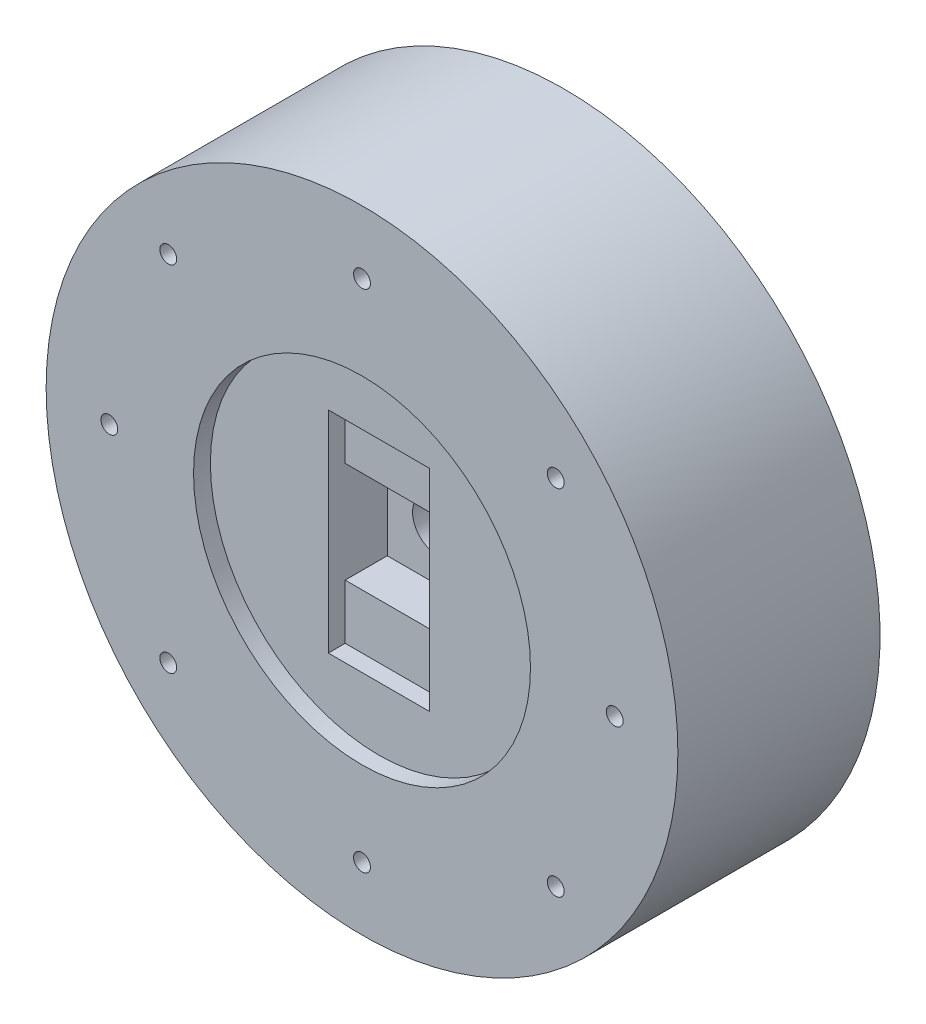
ISO-10303-21;
HEADER;
FILE_DESCRIPTION(('STEP AP214'),'2;1');
FILE_NAME('part.step','',(''),(''),'','','');
FILE_SCHEMA(('AUTOMOTIVE_DESIGN { 1 0 10303 214 1 1 1 1 }'));
ENDSEC;
DATA;
#1=APPLICATION_CONTEXT('core data for automotive mechanical design processes');
#2=APPLICATION_PROTOCOL_DEFINITION('international standard','automotive_design',2000,#1);
#3=PRODUCT_CONTEXT('',#1,'mechanical');
#4=PRODUCT('Part','Part','',(#3));
#5=PRODUCT_RELATED_PRODUCT_CATEGORY('part','',(#4));
#6=PRODUCT_DEFINITION_FORMATION('','',#4);
#7=PRODUCT_DEFINITION_CONTEXT('part definition',#1,'design');
#8=PRODUCT_DEFINITION('design','',#6,#7);
#9=PRODUCT_DEFINITION_SHAPE('','',#8);
#10=(LENGTH_UNIT() NAMED_UNIT(*) SI_UNIT(.MILLI.,.METRE.));
#11=(NAMED_UNIT(*) PLANE_ANGLE_UNIT() SI_UNIT($,.RADIAN.));
#12=(NAMED_UNIT(*) SI_UNIT($,.STERADIAN.) SOLID_ANGLE_UNIT());
#13=UNCERTAINTY_MEASURE_WITH_UNIT(LENGTH_MEASURE(1.E-05),#10,'distance_accuracy_value','');
#14=(GEOMETRIC_REPRESENTATION_CONTEXT(3) GLOBAL_UNCERTAINTY_ASSIGNED_CONTEXT((#13)) GLOBAL_UNIT_ASSIGNED_CONTEXT((#10,
#11,#12)) REPRESENTATION_CONTEXT('',''));
#15=CARTESIAN_POINT('',(0.,0.,0.));
#16=DIRECTION('',(0.,0.,1.));
#17=DIRECTION('',(1.,0.,0.));
#18=AXIS2_PLACEMENT_3D('',#15,#16,#17);
#19=CARTESIAN_POINT('',(0.,0.,12.));
#20=DIRECTION('',(0.,0.,1.));
#21=DIRECTION('',(1.,0.,0.));
#22=AXIS2_PLACEMENT_3D('',#19,#20,#21);
#23=PLANE('',#22);
#24=DIRECTION('',(-1.,0.,0.));
#25=VECTOR('',#24,1.);
#26=CARTESIAN_POINT('',(-6.,12.5,12.));
#27=LINE('',#26,#25);
#28=CARTESIAN_POINT('',(6.,12.5,12.));
#29=VERTEX_POINT('',#28);
#30=CARTESIAN_POINT('',(-6.,12.5,12.));
#31=VERTEX_POINT('',#30);
#32=EDGE_CURVE('E118',#29,#31,#27,.T.);
#33=ORIENTED_EDGE('',*,*,#32,.F.);
#34=DIRECTION('',(0.,1.,0.));
#35=VECTOR('',#34,1.);
#36=CARTESIAN_POINT('',(6.,-12.5,12.));
#37=LINE('',#36,#35);
#38=CARTESIAN_POINT('',(6.,-12.5,12.));
#39=VERTEX_POINT('',#38);
#40=EDGE_CURVE('E111',#39,#29,#37,.T.);
#41=ORIENTED_EDGE('',*,*,#40,.F.);
#42=DIRECTION('',(1.,0.,0.));
#43=VECTOR('',#42,1.);
#44=CARTESIAN_POINT('',(-6.,-12.5,12.));
#45=LINE('',#44,#43);
#46=CARTESIAN_POINT('',(-6.,-12.5,12.));
#47=VERTEX_POINT('',#46);
#48=EDGE_CURVE('E134',#47,#39,#45,.T.);
#49=ORIENTED_EDGE('',*,*,#48,.F.);
#50=DIRECTION('',(0.,-1.,0.));
#51=VECTOR('',#50,1.);
#52=CARTESIAN_POINT('',(-6.,-12.5,12.));
#53=LINE('',#52,#51);
#54=EDGE_CURVE('E132',#31,#47,#53,.T.);
#55=ORIENTED_EDGE('',*,*,#54,.F.);
#56=EDGE_LOOP('',(#33,#41,#49,#55));
#57=FACE_BOUND('',#56,.T.);
#58=CARTESIAN_POINT('',(0.,0.,12.));
#59=DIRECTION('',(0.,0.,1.));
#60=DIRECTION('',(1.,0.,0.));
#61=AXIS2_PLACEMENT_3D('',#58,#59,#60);
#62=CIRCLE('',#61,20.);
#63=CARTESIAN_POINT('',(20.,0.,12.));
#64=VERTEX_POINT('',#63);
#65=EDGE_CURVE('E298',#64,#64,#62,.T.);
#66=ORIENTED_EDGE('',*,*,#65,.T.);
#67=EDGE_LOOP('',(#66));
#68=FACE_BOUND('',#67,.T.);
#69=ADVANCED_FACE('F40',(#57,#68),#23,.T.);
#70=CARTESIAN_POINT('',(0.,0.,10.));
#71=DIRECTION('',(0.,0.,1.));
#72=DIRECTION('',(1.,0.,0.));
#73=AXIS2_PLACEMENT_3D('',#70,#71,#72);
#74=PLANE('',#73);
#75=DIRECTION('',(-1.,0.,0.));
#76=VECTOR('',#75,1.);
#77=CARTESIAN_POINT('',(-6.,6.,10.));
#78=LINE('',#77,#76);
#79=CARTESIAN_POINT('',(6.,6.,10.));
#80=VERTEX_POINT('',#79);
#81=CARTESIAN_POINT('',(-6.,5.99999999999999,10.));
#82=VERTEX_POINT('',#81);
#83=EDGE_CURVE('E173',#80,#82,#78,.T.);
#84=ORIENTED_EDGE('',*,*,#83,.F.);
#85=DIRECTION('',(0.,1.,0.));
#86=VECTOR('',#85,1.);
#87=CARTESIAN_POINT('',(6.,-12.5,10.));
#88=LINE('',#87,#86);
#89=CARTESIAN_POINT('',(6.,12.5,10.));
#90=VERTEX_POINT('',#89);
#91=EDGE_CURVE('E11',#80,#90,#88,.T.);
#92=ORIENTED_EDGE('',*,*,#91,.T.);
#93=DIRECTION('',(-1.,0.,0.));
#94=VECTOR('',#93,1.);
#95=CARTESIAN_POINT('',(-6.,12.5,10.));
#96=LINE('',#95,#94);
#97=CARTESIAN_POINT('',(-6.,12.5,10.));
#98=VERTEX_POINT('',#97);
#99=EDGE_CURVE('E125',#90,#98,#96,.T.);
#100=ORIENTED_EDGE('',*,*,#99,.T.);
#101=DIRECTION('',(0.,-1.,0.));
#102=VECTOR('',#101,1.);
#103=CARTESIAN_POINT('',(-6.,-12.5,10.));
#104=LINE('',#103,#102);
#105=EDGE_CURVE('E141',#98,#82,#104,.T.);
#106=ORIENTED_EDGE('',*,*,#105,.T.);
#107=EDGE_LOOP('',(#84,#92,#100,#106));
#108=FACE_BOUND('',#107,.T.);
#109=ADVANCED_FACE('F223',(#108),#74,.T.);
#110=DIRECTION('',(1.,0.,0.));
#111=VECTOR('',#110,1.);
#112=CARTESIAN_POINT('',(-6.,-12.5,10.));
#113=LINE('',#112,#111);
#114=CARTESIAN_POINT('',(-6.,-12.5,10.));
#115=VERTEX_POINT('',#114);
#116=CARTESIAN_POINT('',(6.,-12.5,10.));
#117=VERTEX_POINT('',#116);
#118=EDGE_CURVE('E119',#115,#117,#113,.T.);
#119=ORIENTED_EDGE('',*,*,#118,.T.);
#120=CARTESIAN_POINT('',(6.,-6.,10.));
#121=VERTEX_POINT('',#120);
#122=EDGE_CURVE('E51',#117,#121,#88,.T.);
#123=ORIENTED_EDGE('',*,*,#122,.T.);
#124=DIRECTION('',(1.,0.,0.));
#125=VECTOR('',#124,1.);
#126=CARTESIAN_POINT('',(-6.,-6.,10.));
#127=LINE('',#126,#125);
#128=CARTESIAN_POINT('',(-6.,-6.,10.));
#129=VERTEX_POINT('',#128);
#130=EDGE_CURVE('E176',#129,#121,#127,.T.);
#131=ORIENTED_EDGE('',*,*,#130,.F.);
#132=EDGE_CURVE('E49',#129,#115,#104,.T.);
#133=ORIENTED_EDGE('',*,*,#132,.T.);
#134=EDGE_LOOP('',(#119,#123,#131,#133));
#135=FACE_BOUND('',#134,.T.);
#136=ADVANCED_FACE('F218',(#135),#74,.T.);
#137=CARTESIAN_POINT('',(0.,0.,5.));
#138=DIRECTION('',(0.,0.,1.));
#139=DIRECTION('',(1.,0.,0.));
#140=AXIS2_PLACEMENT_3D('',#137,#138,#139);
#141=PLANE('',#140);
#142=CARTESIAN_POINT('',(0.,0.,5.));
#143=DIRECTION('',(0.,0.,1.));
#144=DIRECTION('',(1.,0.,0.));
#145=AXIS2_PLACEMENT_3D('',#142,#143,#144);
#146=CIRCLE('',#145,3.);
#147=CARTESIAN_POINT('',(3.,0.,5.));
#148=VERTEX_POINT('',#147);
#149=EDGE_CURVE('E199',#148,#148,#146,.T.);
#150=ORIENTED_EDGE('',*,*,#149,.F.);
#151=EDGE_LOOP('',(#150));
#152=FACE_BOUND('',#151,.T.);
#153=DIRECTION('',(1.,0.,0.));
#154=VECTOR('',#153,1.);
#155=CARTESIAN_POINT('',(-6.,-6.,5.));
#156=LINE('',#155,#154);
#157=CARTESIAN_POINT('',(-6.,-6.,5.));
#158=VERTEX_POINT('',#157);
#159=CARTESIAN_POINT('',(6.,-6.,5.));
#160=VERTEX_POINT('',#159);
#161=EDGE_CURVE('E177',#158,#160,#156,.T.);
#162=ORIENTED_EDGE('',*,*,#161,.T.);
#163=DIRECTION('',(0.,1.,0.));
#164=VECTOR('',#163,1.);
#165=CARTESIAN_POINT('',(6.,-6.,5.));
#166=LINE('',#165,#164);
#167=CARTESIAN_POINT('',(6.,6.,5.));
#168=VERTEX_POINT('',#167);
#169=EDGE_CURVE('E172',#160,#168,#166,.T.);
#170=ORIENTED_EDGE('',*,*,#169,.T.);
#171=DIRECTION('',(-1.,0.,0.));
#172=VECTOR('',#171,1.);
#173=CARTESIAN_POINT('',(-6.,6.,5.));
#174=LINE('',#173,#172);
#175=CARTESIAN_POINT('',(-6.,6.,5.));
#176=VERTEX_POINT('',#175);
#177=EDGE_CURVE('E181',#168,#176,#174,.T.);
#178=ORIENTED_EDGE('',*,*,#177,.T.);
#179=DIRECTION('',(0.,-1.,0.));
#180=VECTOR('',#179,1.);
#181=CARTESIAN_POINT('',(-6.,-6.,5.));
#182=LINE('',#181,#180);
#183=EDGE_CURVE('E184',#176,#158,#182,.T.);
#184=ORIENTED_EDGE('',*,*,#183,.T.);
#185=EDGE_LOOP('',(#162,#170,#178,#184));
#186=FACE_BOUND('',#185,.T.);
#187=ADVANCED_FACE('F211',(#152,#186),#141,.T.);
#188=CARTESIAN_POINT('',(0.,0.,5.));
#189=DIRECTION('',(0.,0.,-1.));
#190=DIRECTION('',(-1.,0.,0.));
#191=AXIS2_PLACEMENT_3D('',#188,#189,#190);
#192=CYLINDRICAL_SURFACE('',#191,3.);
#193=ORIENTED_EDGE('',*,*,#149,.T.);
#194=EDGE_LOOP('',(#193));
#195=FACE_BOUND('',#194,.T.);
#196=CARTESIAN_POINT('',(0.,0.,0.));
#197=DIRECTION('',(0.,0.,1.));
#198=DIRECTION('',(1.,0.,0.));
#199=AXIS2_PLACEMENT_3D('',#196,#197,#198);
#200=CIRCLE('',#199,3.);
#201=CARTESIAN_POINT('',(3.,0.,0.));
#202=VERTEX_POINT('',#201);
#203=EDGE_CURVE('E44',#202,#202,#200,.T.);
#204=ORIENTED_EDGE('',*,*,#203,.F.);
#205=EDGE_LOOP('',(#204));
#206=FACE_BOUND('',#205,.T.);
#207=ADVANCED_FACE('F209',(#195,#206),#192,.F.);
#208=CARTESIAN_POINT('',(0.,0.,0.));
#209=DIRECTION('',(0.,0.,-1.));
#210=DIRECTION('',(-1.,0.,0.));
#211=AXIS2_PLACEMENT_3D('',#208,#209,#210);
#212=PLANE('',#211);
#213=ORIENTED_EDGE('',*,*,#203,.T.);
#214=EDGE_LOOP('',(#213));
#215=FACE_BOUND('',#214,.T.);
#216=ADVANCED_FACE('F207',(#215),#212,.F.);
#217=CARTESIAN_POINT('',(6.,-6.,10.));
#218=DIRECTION('',(-1.,0.,0.));
#219=DIRECTION('',(0.,0.,1.));
#220=AXIS2_PLACEMENT_3D('',#217,#218,#219);
#221=PLANE('',#220);
#222=ORIENTED_EDGE('',*,*,#169,.F.);
#223=DIRECTION('',(0.,0.,-1.));
#224=VECTOR('',#223,1.);
#225=CARTESIAN_POINT('',(6.,-6.,10.));
#226=LINE('',#225,#224);
#227=EDGE_CURVE('E66',#121,#160,#226,.T.);
#228=ORIENTED_EDGE('',*,*,#227,.F.);
#229=ORIENTED_EDGE('',*,*,#122,.F.);
#230=DIRECTION('',(0.,0.,-1.));
#231=VECTOR('',#230,1.);
#232=CARTESIAN_POINT('',(6.,-12.5,12.));
#233=LINE('',#232,#231);
#234=EDGE_CURVE('E58',#39,#117,#233,.T.);
#235=ORIENTED_EDGE('',*,*,#234,.F.);
#236=ORIENTED_EDGE('',*,*,#40,.T.);
#237=DIRECTION('',(0.,0.,-1.));
#238=VECTOR('',#237,1.);
#239=CARTESIAN_POINT('',(6.,12.5,12.));
#240=LINE('',#239,#238);
#241=EDGE_CURVE('E114',#29,#90,#240,.T.);
#242=ORIENTED_EDGE('',*,*,#241,.T.);
#243=ORIENTED_EDGE('',*,*,#91,.F.);
#244=DIRECTION('',(0.,0.,-1.));
#245=VECTOR('',#244,1.);
#246=CARTESIAN_POINT('',(6.,6.,10.));
#247=LINE('',#246,#245);
#248=EDGE_CURVE('E194',#80,#168,#247,.T.);
#249=ORIENTED_EDGE('',*,*,#248,.T.);
#250=EDGE_LOOP('',(#222,#228,#229,#235,#236,#242,#243,#249));
#251=FACE_BOUND('',#250,.T.);
#252=ADVANCED_FACE('F113',(#251),#221,.T.);
#253=CARTESIAN_POINT('',(-6.,6.,10.));
#254=DIRECTION('',(0.,-1.,0.));
#255=DIRECTION('',(0.,0.,-1.));
#256=AXIS2_PLACEMENT_3D('',#253,#254,#255);
#257=PLANE('',#256);
#258=ORIENTED_EDGE('',*,*,#177,.F.);
#259=ORIENTED_EDGE('',*,*,#248,.F.);
#260=ORIENTED_EDGE('',*,*,#83,.T.);
#261=DIRECTION('',(0.,0.,-1.));
#262=VECTOR('',#261,1.);
#263=CARTESIAN_POINT('',(-6.,6.,10.));
#264=LINE('',#263,#262);
#265=EDGE_CURVE('E192',#82,#176,#264,.T.);
#266=ORIENTED_EDGE('',*,*,#265,.T.);
#267=EDGE_LOOP('',(#258,#259,#260,#266));
#268=FACE_BOUND('',#267,.T.);
#269=ADVANCED_FACE('F278',(#268),#257,.T.);
#270=CARTESIAN_POINT('',(-6.,-6.,10.));
#271=DIRECTION('',(1.,0.,0.));
#272=DIRECTION('',(0.,0.,-1.));
#273=AXIS2_PLACEMENT_3D('',#270,#271,#272);
#274=PLANE('',#273);
#275=ORIENTED_EDGE('',*,*,#183,.F.);
#276=ORIENTED_EDGE('',*,*,#265,.F.);
#277=ORIENTED_EDGE('',*,*,#105,.F.);
#278=DIRECTION('',(0.,0.,-1.));
#279=VECTOR('',#278,1.);
#280=CARTESIAN_POINT('',(-6.,12.5,12.));
#281=LINE('',#280,#279);
#282=EDGE_CURVE('E127',#31,#98,#281,.T.);
#283=ORIENTED_EDGE('',*,*,#282,.F.);
#284=ORIENTED_EDGE('',*,*,#54,.T.);
#285=DIRECTION('',(0.,0.,-1.));
#286=VECTOR('',#285,1.);
#287=CARTESIAN_POINT('',(-6.,-12.5,12.));
#288=LINE('',#287,#286);
#289=EDGE_CURVE('E146',#47,#115,#288,.T.);
#290=ORIENTED_EDGE('',*,*,#289,.T.);
#291=ORIENTED_EDGE('',*,*,#132,.F.);
#292=DIRECTION('',(0.,0.,-1.));
#293=VECTOR('',#292,1.);
#294=CARTESIAN_POINT('',(-6.,-6.,10.));
#295=LINE('',#294,#293);
#296=EDGE_CURVE('E190',#129,#158,#295,.T.);
#297=ORIENTED_EDGE('',*,*,#296,.T.);
#298=EDGE_LOOP('',(#275,#276,#277,#283,#284,#290,#291,#297));
#299=FACE_BOUND('',#298,.T.);
#300=ADVANCED_FACE('F275',(#299),#274,.T.);
#301=CARTESIAN_POINT('',(-6.,-6.,10.));
#302=DIRECTION('',(0.,1.,0.));
#303=DIRECTION('',(0.,0.,1.));
#304=AXIS2_PLACEMENT_3D('',#301,#302,#303);
#305=PLANE('',#304);
#306=ORIENTED_EDGE('',*,*,#161,.F.);
#307=ORIENTED_EDGE('',*,*,#296,.F.);
#308=ORIENTED_EDGE('',*,*,#130,.T.);
#309=ORIENTED_EDGE('',*,*,#227,.T.);
#310=EDGE_LOOP('',(#306,#307,#308,#309));
#311=FACE_BOUND('',#310,.T.);
#312=ADVANCED_FACE('F272',(#311),#305,.T.);
#313=CARTESIAN_POINT('',(-6.,12.5,12.));
#314=DIRECTION('',(0.,-1.,0.));
#315=DIRECTION('',(1.,0.,0.));
#316=AXIS2_PLACEMENT_3D('',#313,#314,#315);
#317=PLANE('',#316);
#318=ORIENTED_EDGE('',*,*,#99,.F.);
#319=ORIENTED_EDGE('',*,*,#241,.F.);
#320=ORIENTED_EDGE('',*,*,#32,.T.);
#321=ORIENTED_EDGE('',*,*,#282,.T.);
#322=EDGE_LOOP('',(#318,#319,#320,#321));
#323=FACE_BOUND('',#322,.T.);
#324=ADVANCED_FACE('F122',(#323),#317,.T.);
#325=CARTESIAN_POINT('',(-6.,-12.5,12.));
#326=DIRECTION('',(0.,1.,0.));
#327=DIRECTION('',(-1.,0.,0.));
#328=AXIS2_PLACEMENT_3D('',#325,#326,#327);
#329=PLANE('',#328);
#330=ORIENTED_EDGE('',*,*,#118,.F.);
#331=ORIENTED_EDGE('',*,*,#289,.F.);
#332=ORIENTED_EDGE('',*,*,#48,.T.);
#333=ORIENTED_EDGE('',*,*,#234,.T.);
#334=EDGE_LOOP('',(#330,#331,#332,#333));
#335=FACE_BOUND('',#334,.T.);
#336=ADVANCED_FACE('F332',(#335),#329,.T.);
#337=CARTESIAN_POINT('',(0.,0.,14.));
#338=DIRECTION('',(0.,0.,1.));
#339=DIRECTION('',(1.,0.,0.));
#340=AXIS2_PLACEMENT_3D('',#337,#338,#339);
#341=PLANE('',#340);
#342=CARTESIAN_POINT('',(-23.,-21.,14.));
#343=DIRECTION('',(0.,0.,1.));
#344=DIRECTION('',(1.,0.,0.));
#345=AXIS2_PLACEMENT_3D('',#342,#343,#344);
#346=CIRCLE('',#345,1.);
#347=CARTESIAN_POINT('',(-22.,-21.,14.));
#348=VERTEX_POINT('',#347);
#349=EDGE_CURVE('E321',#348,#348,#346,.T.);
#350=ORIENTED_EDGE('',*,*,#349,.F.);
#351=EDGE_LOOP('',(#350));
#352=FACE_BOUND('',#351,.T.);
#353=CARTESIAN_POINT('',(-23.,21.,14.));
#354=DIRECTION('',(0.,0.,1.));
#355=DIRECTION('',(1.,0.,0.));
#356=AXIS2_PLACEMENT_3D('',#353,#354,#355);
#357=CIRCLE('',#356,1.);
#358=CARTESIAN_POINT('',(-22.,21.,14.));
#359=VERTEX_POINT('',#358);
#360=EDGE_CURVE('E315',#359,#359,#357,.T.);
#361=ORIENTED_EDGE('',*,*,#360,.F.);
#362=EDGE_LOOP('',(#361));
#363=FACE_BOUND('',#362,.T.);
#364=CARTESIAN_POINT('',(-30.,0.,14.));
#365=DIRECTION('',(0.,0.,1.));
#366=DIRECTION('',(1.,0.,0.));
#367=AXIS2_PLACEMENT_3D('',#364,#365,#366);
#368=CIRCLE('',#367,1.);
#369=CARTESIAN_POINT('',(-29.,0.,14.));
#370=VERTEX_POINT('',#369);
#371=EDGE_CURVE('E309',#370,#370,#368,.T.);
#372=ORIENTED_EDGE('',*,*,#371,.F.);
#373=EDGE_LOOP('',(#372));
#374=FACE_BOUND('',#373,.T.);
#375=CARTESIAN_POINT('',(0.,30.,14.));
#376=DIRECTION('',(0.,0.,1.));
#377=DIRECTION('',(1.,0.,0.));
#378=AXIS2_PLACEMENT_3D('',#375,#376,#377);
#379=CIRCLE('',#378,1.);
#380=CARTESIAN_POINT('',(1.,30.,14.));
#381=VERTEX_POINT('',#380);
#382=EDGE_CURVE('E302',#381,#381,#379,.T.);
#383=ORIENTED_EDGE('',*,*,#382,.F.);
#384=EDGE_LOOP('',(#383));
#385=FACE_BOUND('',#384,.T.);
#386=CARTESIAN_POINT('',(0.,0.,14.));
#387=DIRECTION('',(0.,0.,1.));
#388=DIRECTION('',(1.,0.,0.));
#389=AXIS2_PLACEMENT_3D('',#386,#387,#388);
#390=CIRCLE('',#389,37.5);
#391=CARTESIAN_POINT('',(37.5,0.,14.));
#392=VERTEX_POINT('',#391);
#393=EDGE_CURVE('E139',#392,#392,#390,.T.);
#394=ORIENTED_EDGE('',*,*,#393,.T.);
#395=EDGE_LOOP('',(#394));
#396=FACE_BOUND('',#395,.T.);
#397=CARTESIAN_POINT('',(0.,0.,14.));
#398=DIRECTION('',(0.,0.,1.));
#399=DIRECTION('',(1.,0.,0.));
#400=AXIS2_PLACEMENT_3D('',#397,#398,#399);
#401=CIRCLE('',#400,20.);
#402=CARTESIAN_POINT('',(20.,0.,14.));
#403=VERTEX_POINT('',#402);
#404=EDGE_CURVE('E296',#403,#403,#401,.T.);
#405=ORIENTED_EDGE('',*,*,#404,.F.);
#406=EDGE_LOOP('',(#405));
#407=FACE_BOUND('',#406,.T.);
#408=CARTESIAN_POINT('',(0.,-30.,14.));
#409=DIRECTION('',(0.,0.,1.));
#410=DIRECTION('',(1.,0.,0.));
#411=AXIS2_PLACEMENT_3D('',#408,#409,#410);
#412=CIRCLE('',#411,1.);
#413=CARTESIAN_POINT('',(1.,-30.,14.));
#414=VERTEX_POINT('',#413);
#415=EDGE_CURVE('E306',#414,#414,#412,.T.);
#416=ORIENTED_EDGE('',*,*,#415,.F.);
#417=EDGE_LOOP('',(#416));
#418=FACE_BOUND('',#417,.T.);
#419=CARTESIAN_POINT('',(30.,0.,14.));
#420=DIRECTION('',(0.,0.,1.));
#421=DIRECTION('',(1.,0.,0.));
#422=AXIS2_PLACEMENT_3D('',#419,#420,#421);
#423=CIRCLE('',#422,1.);
#424=CARTESIAN_POINT('',(31.,0.,14.));
#425=VERTEX_POINT('',#424);
#426=EDGE_CURVE('E312',#425,#425,#423,.T.);
#427=ORIENTED_EDGE('',*,*,#426,.F.);
#428=EDGE_LOOP('',(#427));
#429=FACE_BOUND('',#428,.T.);
#430=CARTESIAN_POINT('',(23.,21.,14.));
#431=DIRECTION('',(0.,0.,1.));
#432=DIRECTION('',(1.,0.,0.));
#433=AXIS2_PLACEMENT_3D('',#430,#431,#432);
#434=CIRCLE('',#433,1.);
#435=CARTESIAN_POINT('',(24.,21.,14.));
#436=VERTEX_POINT('',#435);
#437=EDGE_CURVE('E318',#436,#436,#434,.T.);
#438=ORIENTED_EDGE('',*,*,#437,.F.);
#439=EDGE_LOOP('',(#438));
#440=FACE_BOUND('',#439,.T.);
#441=CARTESIAN_POINT('',(23.,-21.,14.));
#442=DIRECTION('',(0.,0.,1.));
#443=DIRECTION('',(1.,0.,0.));
#444=AXIS2_PLACEMENT_3D('',#441,#442,#443);
#445=CIRCLE('',#444,1.);
#446=CARTESIAN_POINT('',(24.,-21.,14.));
#447=VERTEX_POINT('',#446);
#448=EDGE_CURVE('E324',#447,#447,#445,.T.);
#449=ORIENTED_EDGE('',*,*,#448,.F.);
#450=EDGE_LOOP('',(#449));
#451=FACE_BOUND('',#450,.T.);
#452=ADVANCED_FACE('F329',(#352,#363,#374,#385,#396,#407,#418,#429,#440,#451),#341,.T.);
#453=CARTESIAN_POINT('',(0.,0.,14.));
#454=DIRECTION('',(0.,0.,-1.));
#455=DIRECTION('',(-1.,0.,0.));
#456=AXIS2_PLACEMENT_3D('',#453,#454,#455);
#457=CYLINDRICAL_SURFACE('',#456,20.);
#458=ORIENTED_EDGE('',*,*,#404,.T.);
#459=EDGE_LOOP('',(#458));
#460=FACE_BOUND('',#459,.T.);
#461=ORIENTED_EDGE('',*,*,#65,.F.);
#462=EDGE_LOOP('',(#461));
#463=FACE_BOUND('',#462,.T.);
#464=ADVANCED_FACE('F331',(#460,#463),#457,.F.);
#465=CARTESIAN_POINT('',(23.,21.,5.));
#466=DIRECTION('',(0.,0.,1.));
#467=DIRECTION('',(1.,0.,0.));
#468=AXIS2_PLACEMENT_3D('',#465,#466,#467);
#469=CIRCLE('',#468,1.);
#470=CARTESIAN_POINT('',(24.,21.,5.));
#471=VERTEX_POINT('',#470);
#472=EDGE_CURVE('E126',#471,#471,#469,.T.);
#473=ORIENTED_EDGE('',*,*,#472,.T.);
#474=EDGE_LOOP('',(#473));
#475=FACE_BOUND('',#474,.T.);
#476=ADVANCED_FACE('F221',(#475),#141,.T.);
#477=CARTESIAN_POINT('',(23.,21.,10.));
#478=DIRECTION('',(0.,0.,-1.));
#479=DIRECTION('',(-1.,0.,0.));
#480=AXIS2_PLACEMENT_3D('',#477,#478,#479);
#481=CYLINDRICAL_SURFACE('',#480,1.);
#482=ORIENTED_EDGE('',*,*,#472,.F.);
#483=EDGE_LOOP('',(#482));
#484=FACE_BOUND('',#483,.T.);
#485=ORIENTED_EDGE('',*,*,#437,.T.);
#486=EDGE_LOOP('',(#485));
#487=FACE_BOUND('',#486,.T.);
#488=ADVANCED_FACE('F233',(#484,#487),#481,.F.);
#489=CARTESIAN_POINT('',(23.,-21.,5.));
#490=DIRECTION('',(0.,0.,1.));
#491=DIRECTION('',(1.,0.,0.));
#492=AXIS2_PLACEMENT_3D('',#489,#490,#491);
#493=CIRCLE('',#492,1.);
#494=CARTESIAN_POINT('',(24.,-21.,5.));
#495=VERTEX_POINT('',#494);
#496=EDGE_CURVE('E151',#495,#495,#493,.T.);
#497=ORIENTED_EDGE('',*,*,#496,.T.);
#498=EDGE_LOOP('',(#497));
#499=FACE_BOUND('',#498,.T.);
#500=ADVANCED_FACE('F236',(#499),#141,.T.);
#501=CARTESIAN_POINT('',(23.,-21.,10.));
#502=DIRECTION('',(0.,0.,-1.));
#503=DIRECTION('',(-1.,0.,0.));
#504=AXIS2_PLACEMENT_3D('',#501,#502,#503);
#505=CYLINDRICAL_SURFACE('',#504,1.);
#506=ORIENTED_EDGE('',*,*,#496,.F.);
#507=EDGE_LOOP('',(#506));
#508=FACE_BOUND('',#507,.T.);
#509=ORIENTED_EDGE('',*,*,#448,.T.);
#510=EDGE_LOOP('',(#509));
#511=FACE_BOUND('',#510,.T.);
#512=ADVANCED_FACE('F238',(#508,#511),#505,.F.);
#513=CARTESIAN_POINT('',(30.,0.,5.));
#514=DIRECTION('',(0.,0.,1.));
#515=DIRECTION('',(1.,0.,0.));
#516=AXIS2_PLACEMENT_3D('',#513,#514,#515);
#517=CIRCLE('',#516,1.);
#518=CARTESIAN_POINT('',(31.,0.,5.));
#519=VERTEX_POINT('',#518);
#520=EDGE_CURVE('E160',#519,#519,#517,.T.);
#521=ORIENTED_EDGE('',*,*,#520,.T.);
#522=EDGE_LOOP('',(#521));
#523=FACE_BOUND('',#522,.T.);
#524=ADVANCED_FACE('F241',(#523),#141,.T.);
#525=CARTESIAN_POINT('',(30.,0.,10.));
#526=DIRECTION('',(0.,0.,-1.));
#527=DIRECTION('',(-1.,0.,0.));
#528=AXIS2_PLACEMENT_3D('',#525,#526,#527);
#529=CYLINDRICAL_SURFACE('',#528,1.);
#530=ORIENTED_EDGE('',*,*,#520,.F.);
#531=EDGE_LOOP('',(#530));
#532=FACE_BOUND('',#531,.T.);
#533=ORIENTED_EDGE('',*,*,#426,.T.);
#534=EDGE_LOOP('',(#533));
#535=FACE_BOUND('',#534,.T.);
#536=ADVANCED_FACE('F253',(#532,#535),#529,.F.);
#537=CARTESIAN_POINT('',(0.,-30.,5.));
#538=DIRECTION('',(0.,0.,1.));
#539=DIRECTION('',(1.,0.,0.));
#540=AXIS2_PLACEMENT_3D('',#537,#538,#539);
#541=CIRCLE('',#540,1.);
#542=CARTESIAN_POINT('',(1.,-30.,5.));
#543=VERTEX_POINT('',#542);
#544=EDGE_CURVE('E166',#543,#543,#541,.T.);
#545=ORIENTED_EDGE('',*,*,#544,.T.);
#546=EDGE_LOOP('',(#545));
#547=FACE_BOUND('',#546,.T.);
#548=ADVANCED_FACE('F256',(#547),#141,.T.);
#549=CARTESIAN_POINT('',(0.,-30.,10.));
#550=DIRECTION('',(0.,0.,-1.));
#551=DIRECTION('',(-1.,0.,0.));
#552=AXIS2_PLACEMENT_3D('',#549,#550,#551);
#553=CYLINDRICAL_SURFACE('',#552,1.);
#554=ORIENTED_EDGE('',*,*,#544,.F.);
#555=EDGE_LOOP('',(#554));
#556=FACE_BOUND('',#555,.T.);
#557=ORIENTED_EDGE('',*,*,#415,.T.);
#558=EDGE_LOOP('',(#557));
#559=FACE_BOUND('',#558,.T.);
#560=ADVANCED_FACE('F263',(#556,#559),#553,.F.);
#561=CARTESIAN_POINT('',(0.,0.,-10.));
#562=DIRECTION('',(0.,0.,-1.));
#563=DIRECTION('',(-1.,0.,0.));
#564=AXIS2_PLACEMENT_3D('',#561,#562,#563);
#565=PLANE('',#564);
#566=CARTESIAN_POINT('',(0.,0.,-10.));
#567=DIRECTION('',(0.,0.,-1.));
#568=DIRECTION('',(-1.,0.,0.));
#569=AXIS2_PLACEMENT_3D('',#566,#567,#568);
#570=CIRCLE('',#569,37.5);
#571=CARTESIAN_POINT('',(-37.5,0.,-10.));
#572=VERTEX_POINT('',#571);
#573=EDGE_CURVE('E197',#572,#572,#570,.T.);
#574=ORIENTED_EDGE('',*,*,#573,.T.);
#575=EDGE_LOOP('',(#574));
#576=FACE_BOUND('',#575,.T.);
#577=ADVANCED_FACE('F266',(#576),#565,.T.);
#578=CARTESIAN_POINT('',(0.,0.,5.));
#579=DIRECTION('',(0.,0.,-1.));
#580=DIRECTION('',(-1.,0.,0.));
#581=AXIS2_PLACEMENT_3D('',#578,#579,#580);
#582=CYLINDRICAL_SURFACE('',#581,37.5);
#583=ORIENTED_EDGE('',*,*,#573,.F.);
#584=EDGE_LOOP('',(#583));
#585=FACE_BOUND('',#584,.T.);
#586=ORIENTED_EDGE('',*,*,#393,.F.);
#587=EDGE_LOOP('',(#586));
#588=FACE_BOUND('',#587,.T.);
#589=ADVANCED_FACE('F42',(#585,#588),#582,.T.);
#590=CARTESIAN_POINT('',(0.,30.,5.));
#591=DIRECTION('',(0.,0.,1.));
#592=DIRECTION('',(1.,0.,0.));
#593=AXIS2_PLACEMENT_3D('',#590,#591,#592);
#594=CIRCLE('',#593,1.);
#595=CARTESIAN_POINT('',(1.,30.,5.));
#596=VERTEX_POINT('',#595);
#597=EDGE_CURVE('E169',#596,#596,#594,.T.);
#598=ORIENTED_EDGE('',*,*,#597,.T.);
#599=EDGE_LOOP('',(#598));
#600=FACE_BOUND('',#599,.T.);
#601=ADVANCED_FACE('F220',(#600),#141,.T.);
#602=CARTESIAN_POINT('',(0.,30.,10.));
#603=DIRECTION('',(0.,0.,-1.));
#604=DIRECTION('',(-1.,0.,0.));
#605=AXIS2_PLACEMENT_3D('',#602,#603,#604);
#606=CYLINDRICAL_SURFACE('',#605,1.);
#607=ORIENTED_EDGE('',*,*,#597,.F.);
#608=EDGE_LOOP('',(#607));
#609=FACE_BOUND('',#608,.T.);
#610=ORIENTED_EDGE('',*,*,#382,.T.);
#611=EDGE_LOOP('',(#610));
#612=FACE_BOUND('',#611,.T.);
#613=ADVANCED_FACE('F268',(#609,#612),#606,.F.);
#614=CARTESIAN_POINT('',(-30.,0.,5.));
#615=DIRECTION('',(0.,0.,1.));
#616=DIRECTION('',(1.,0.,0.));
#617=AXIS2_PLACEMENT_3D('',#614,#615,#616);
#618=CIRCLE('',#617,1.);
#619=CARTESIAN_POINT('',(-29.,0.,5.));
#620=VERTEX_POINT('',#619);
#621=EDGE_CURVE('E163',#620,#620,#618,.T.);
#622=ORIENTED_EDGE('',*,*,#621,.T.);
#623=EDGE_LOOP('',(#622));
#624=FACE_BOUND('',#623,.T.);
#625=ADVANCED_FACE('F261',(#624),#141,.T.);
#626=CARTESIAN_POINT('',(-30.,0.,10.));
#627=DIRECTION('',(0.,0.,-1.));
#628=DIRECTION('',(-1.,0.,0.));
#629=AXIS2_PLACEMENT_3D('',#626,#627,#628);
#630=CYLINDRICAL_SURFACE('',#629,1.);
#631=ORIENTED_EDGE('',*,*,#621,.F.);
#632=EDGE_LOOP('',(#631));
#633=FACE_BOUND('',#632,.T.);
#634=ORIENTED_EDGE('',*,*,#371,.T.);
#635=EDGE_LOOP('',(#634));
#636=FACE_BOUND('',#635,.T.);
#637=ADVANCED_FACE('F258',(#633,#636),#630,.F.);
#638=CARTESIAN_POINT('',(-23.,-21.,5.));
#639=DIRECTION('',(0.,0.,1.));
#640=DIRECTION('',(1.,0.,0.));
#641=AXIS2_PLACEMENT_3D('',#638,#639,#640);
#642=CIRCLE('',#641,1.);
#643=CARTESIAN_POINT('',(-22.,-21.,5.));
#644=VERTEX_POINT('',#643);
#645=EDGE_CURVE('E154',#644,#644,#642,.T.);
#646=ORIENTED_EDGE('',*,*,#645,.T.);
#647=EDGE_LOOP('',(#646));
#648=FACE_BOUND('',#647,.T.);
#649=ADVANCED_FACE('F247',(#648),#141,.T.);
#650=CARTESIAN_POINT('',(-23.,-21.,10.));
#651=DIRECTION('',(0.,0.,-1.));
#652=DIRECTION('',(-1.,0.,0.));
#653=AXIS2_PLACEMENT_3D('',#650,#651,#652);
#654=CYLINDRICAL_SURFACE('',#653,1.);
#655=ORIENTED_EDGE('',*,*,#645,.F.);
#656=EDGE_LOOP('',(#655));
#657=FACE_BOUND('',#656,.T.);
#658=ORIENTED_EDGE('',*,*,#349,.T.);
#659=EDGE_LOOP('',(#658));
#660=FACE_BOUND('',#659,.T.);
#661=ADVANCED_FACE('F243',(#657,#660),#654,.F.);
#662=CARTESIAN_POINT('',(-23.,21.,5.));
#663=DIRECTION('',(0.,0.,1.));
#664=DIRECTION('',(1.,0.,0.));
#665=AXIS2_PLACEMENT_3D('',#662,#663,#664);
#666=CIRCLE('',#665,1.);
#667=CARTESIAN_POINT('',(-22.,21.,5.));
#668=VERTEX_POINT('',#667);
#669=EDGE_CURVE('E157',#668,#668,#666,.T.);
#670=ORIENTED_EDGE('',*,*,#669,.T.);
#671=EDGE_LOOP('',(#670));
#672=FACE_BOUND('',#671,.T.);
#673=ADVANCED_FACE('F246',(#672),#141,.T.);
#674=CARTESIAN_POINT('',(-23.,21.,10.));
#675=DIRECTION('',(0.,0.,-1.));
#676=DIRECTION('',(-1.,0.,0.));
#677=AXIS2_PLACEMENT_3D('',#674,#675,#676);
#678=CYLINDRICAL_SURFACE('',#677,1.);
#679=ORIENTED_EDGE('',*,*,#669,.F.);
#680=EDGE_LOOP('',(#679));
#681=FACE_BOUND('',#680,.T.);
#682=ORIENTED_EDGE('',*,*,#360,.T.);
#683=EDGE_LOOP('',(#682));
#684=FACE_BOUND('',#683,.T.);
#685=ADVANCED_FACE('F249',(#681,#684),#678,.F.);
#686=CLOSED_SHELL('',(#69,#109,#136,#187,#207,#216,#252,#269,#300,#312,#324,#336,#452,#464,#476,
#488,#500,#512,#524,#536,#548,#560,#577,#589,#601,#613,#625,#637,#649,#661,#673,#685));
#687=MANIFOLD_SOLID_BREP('B2',#686);
#688=ADVANCED_BREP_SHAPE_REPRESENTATION('',(#18,#687),#14);
#689=SHAPE_DEFINITION_REPRESENTATION(#9,#688);
ENDSEC;
END-ISO-10303-21;
